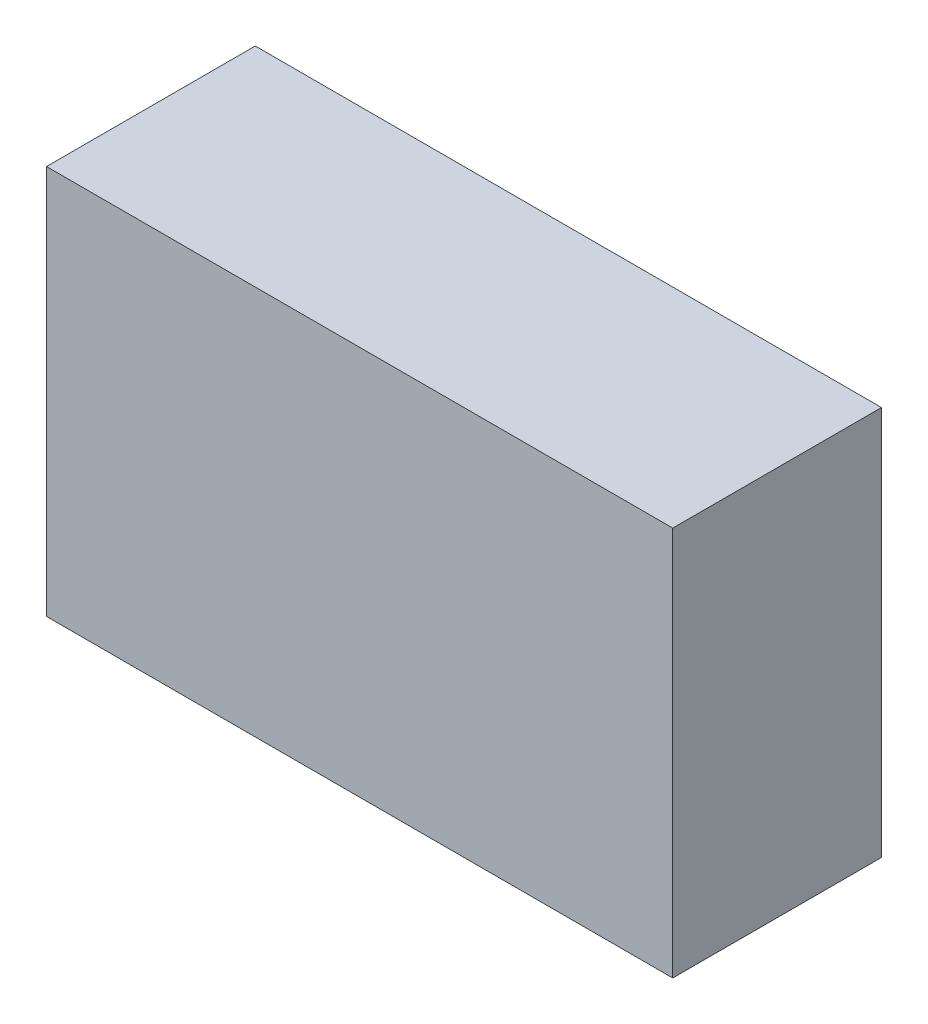
ISO-10303-21;
HEADER;
FILE_DESCRIPTION(('STEP AP214'),'2;1');
FILE_NAME('part.step','',(''),(''),'','','');
FILE_SCHEMA(('AUTOMOTIVE_DESIGN { 1 0 10303 214 1 1 1 1 }'));
ENDSEC;
DATA;
#1=APPLICATION_CONTEXT('core data for automotive mechanical design processes');
#2=APPLICATION_PROTOCOL_DEFINITION('international standard','automotive_design',2000,#1);
#3=PRODUCT_CONTEXT('',#1,'mechanical');
#4=PRODUCT('Part','Part','',(#3));
#5=PRODUCT_RELATED_PRODUCT_CATEGORY('part','',(#4));
#6=PRODUCT_DEFINITION_FORMATION('','',#4);
#7=PRODUCT_DEFINITION_CONTEXT('part definition',#1,'design');
#8=PRODUCT_DEFINITION('design','',#6,#7);
#9=PRODUCT_DEFINITION_SHAPE('','',#8);
#10=(LENGTH_UNIT() NAMED_UNIT(*) SI_UNIT(.MILLI.,.METRE.));
#11=(NAMED_UNIT(*) PLANE_ANGLE_UNIT() SI_UNIT($,.RADIAN.));
#12=(NAMED_UNIT(*) SI_UNIT($,.STERADIAN.) SOLID_ANGLE_UNIT());
#13=UNCERTAINTY_MEASURE_WITH_UNIT(LENGTH_MEASURE(1.E-05),#10,'distance_accuracy_value','');
#14=(GEOMETRIC_REPRESENTATION_CONTEXT(3) GLOBAL_UNCERTAINTY_ASSIGNED_CONTEXT((#13)) GLOBAL_UNIT_ASSIGNED_CONTEXT((#10,
#11,#12)) REPRESENTATION_CONTEXT('',''));
#15=CARTESIAN_POINT('',(0.,0.,0.));
#16=DIRECTION('',(0.,0.,1.));
#17=DIRECTION('',(1.,0.,0.));
#18=AXIS2_PLACEMENT_3D('',#15,#16,#17);
#19=CARTESIAN_POINT('',(-22.5,-14.,15.));
#20=DIRECTION('',(1.,0.,0.));
#21=DIRECTION('',(0.,0.,-1.));
#22=AXIS2_PLACEMENT_3D('',#19,#20,#21);
#23=PLANE('',#22);
#24=DIRECTION('',(0.,-1.,0.));
#25=VECTOR('',#24,1.);
#26=CARTESIAN_POINT('',(-22.5,-14.,0.));
#27=LINE('',#26,#25);
#28=CARTESIAN_POINT('',(-22.5,14.,0.));
#29=VERTEX_POINT('',#28);
#30=CARTESIAN_POINT('',(-22.5,-14.,0.));
#31=VERTEX_POINT('',#30);
#32=EDGE_CURVE('E102',#29,#31,#27,.T.);
#33=ORIENTED_EDGE('',*,*,#32,.T.);
#34=DIRECTION('',(0.,0.,-1.));
#35=VECTOR('',#34,1.);
#36=CARTESIAN_POINT('',(-22.5,-14.,15.));
#37=LINE('',#36,#35);
#38=CARTESIAN_POINT('',(-22.5,-14.,15.));
#39=VERTEX_POINT('',#38);
#40=EDGE_CURVE('E11',#39,#31,#37,.T.);
#41=ORIENTED_EDGE('',*,*,#40,.F.);
#42=DIRECTION('',(0.,-1.,0.));
#43=VECTOR('',#42,1.);
#44=CARTESIAN_POINT('',(-22.5,-14.,15.));
#45=LINE('',#44,#43);
#46=CARTESIAN_POINT('',(-22.5,14.,15.));
#47=VERTEX_POINT('',#46);
#48=EDGE_CURVE('E90',#47,#39,#45,.T.);
#49=ORIENTED_EDGE('',*,*,#48,.F.);
#50=DIRECTION('',(0.,0.,-1.));
#51=VECTOR('',#50,1.);
#52=CARTESIAN_POINT('',(-22.5,14.,15.));
#53=LINE('',#52,#51);
#54=EDGE_CURVE('E98',#47,#29,#53,.T.);
#55=ORIENTED_EDGE('',*,*,#54,.T.);
#56=EDGE_LOOP('',(#33,#41,#49,#55));
#57=FACE_BOUND('',#56,.T.);
#58=ADVANCED_FACE('F39',(#57),#23,.F.);
#59=CARTESIAN_POINT('',(-22.5,-14.,15.));
#60=DIRECTION('',(0.,1.,0.));
#61=DIRECTION('',(0.,0.,1.));
#62=AXIS2_PLACEMENT_3D('',#59,#60,#61);
#63=PLANE('',#62);
#64=DIRECTION('',(1.,0.,0.));
#65=VECTOR('',#64,1.);
#66=CARTESIAN_POINT('',(-22.5,-14.,0.));
#67=LINE('',#66,#65);
#68=CARTESIAN_POINT('',(22.5,-14.,0.));
#69=VERTEX_POINT('',#68);
#70=EDGE_CURVE('E94',#31,#69,#67,.T.);
#71=ORIENTED_EDGE('',*,*,#70,.T.);
#72=DIRECTION('',(0.,0.,-1.));
#73=VECTOR('',#72,1.);
#74=CARTESIAN_POINT('',(22.5,-14.,15.));
#75=LINE('',#74,#73);
#76=CARTESIAN_POINT('',(22.5,-14.,15.));
#77=VERTEX_POINT('',#76);
#78=EDGE_CURVE('E47',#77,#69,#75,.T.);
#79=ORIENTED_EDGE('',*,*,#78,.F.);
#80=DIRECTION('',(1.,0.,0.));
#81=VECTOR('',#80,1.);
#82=CARTESIAN_POINT('',(-22.5,-14.,15.));
#83=LINE('',#82,#81);
#84=EDGE_CURVE('E85',#39,#77,#83,.T.);
#85=ORIENTED_EDGE('',*,*,#84,.F.);
#86=ORIENTED_EDGE('',*,*,#40,.T.);
#87=EDGE_LOOP('',(#71,#79,#85,#86));
#88=FACE_BOUND('',#87,.T.);
#89=ADVANCED_FACE('F93',(#88),#63,.F.);
#90=CARTESIAN_POINT('',(22.5,-14.,15.));
#91=DIRECTION('',(-1.,0.,0.));
#92=DIRECTION('',(0.,0.,1.));
#93=AXIS2_PLACEMENT_3D('',#90,#91,#92);
#94=PLANE('',#93);
#95=DIRECTION('',(0.,1.,0.));
#96=VECTOR('',#95,1.);
#97=CARTESIAN_POINT('',(22.5,-14.,0.));
#98=LINE('',#97,#96);
#99=CARTESIAN_POINT('',(22.5,14.,0.));
#100=VERTEX_POINT('',#99);
#101=EDGE_CURVE('E72',#69,#100,#98,.T.);
#102=ORIENTED_EDGE('',*,*,#101,.T.);
#103=DIRECTION('',(0.,0.,-1.));
#104=VECTOR('',#103,1.);
#105=CARTESIAN_POINT('',(22.5,14.,15.));
#106=LINE('',#105,#104);
#107=CARTESIAN_POINT('',(22.5,14.,15.));
#108=VERTEX_POINT('',#107);
#109=EDGE_CURVE('E95',#108,#100,#106,.T.);
#110=ORIENTED_EDGE('',*,*,#109,.F.);
#111=DIRECTION('',(0.,1.,0.));
#112=VECTOR('',#111,1.);
#113=CARTESIAN_POINT('',(22.5,-14.,15.));
#114=LINE('',#113,#112);
#115=EDGE_CURVE('E88',#77,#108,#114,.T.);
#116=ORIENTED_EDGE('',*,*,#115,.F.);
#117=ORIENTED_EDGE('',*,*,#78,.T.);
#118=EDGE_LOOP('',(#102,#110,#116,#117));
#119=FACE_BOUND('',#118,.T.);
#120=ADVANCED_FACE('F96',(#119),#94,.F.);
#121=CARTESIAN_POINT('',(-22.5,14.,15.));
#122=DIRECTION('',(0.,-1.,0.));
#123=DIRECTION('',(0.,0.,-1.));
#124=AXIS2_PLACEMENT_3D('',#121,#122,#123);
#125=PLANE('',#124);
#126=DIRECTION('',(-1.,0.,0.));
#127=VECTOR('',#126,1.);
#128=CARTESIAN_POINT('',(-22.5,14.,0.));
#129=LINE('',#128,#127);
#130=EDGE_CURVE('E78',#100,#29,#129,.T.);
#131=ORIENTED_EDGE('',*,*,#130,.T.);
#132=ORIENTED_EDGE('',*,*,#54,.F.);
#133=DIRECTION('',(-1.,0.,0.));
#134=VECTOR('',#133,1.);
#135=CARTESIAN_POINT('',(-22.5,14.,15.));
#136=LINE('',#135,#134);
#137=EDGE_CURVE('E55',#108,#47,#136,.T.);
#138=ORIENTED_EDGE('',*,*,#137,.F.);
#139=ORIENTED_EDGE('',*,*,#109,.T.);
#140=EDGE_LOOP('',(#131,#132,#138,#139));
#141=FACE_BOUND('',#140,.T.);
#142=ADVANCED_FACE('F109',(#141),#125,.F.);
#143=CARTESIAN_POINT('',(0.,0.,15.));
#144=DIRECTION('',(0.,0.,-1.));
#145=DIRECTION('',(-1.,0.,0.));
#146=AXIS2_PLACEMENT_3D('',#143,#144,#145);
#147=PLANE('',#146);
#148=ORIENTED_EDGE('',*,*,#48,.T.);
#149=ORIENTED_EDGE('',*,*,#84,.T.);
#150=ORIENTED_EDGE('',*,*,#115,.T.);
#151=ORIENTED_EDGE('',*,*,#137,.T.);
#152=EDGE_LOOP('',(#148,#149,#150,#151));
#153=FACE_BOUND('',#152,.T.);
#154=ADVANCED_FACE('F86',(#153),#147,.F.);
#155=CARTESIAN_POINT('',(0.,0.,0.));
#156=DIRECTION('',(0.,0.,-1.));
#157=DIRECTION('',(-1.,0.,0.));
#158=AXIS2_PLACEMENT_3D('',#155,#156,#157);
#159=PLANE('',#158);
#160=ORIENTED_EDGE('',*,*,#32,.F.);
#161=ORIENTED_EDGE('',*,*,#130,.F.);
#162=ORIENTED_EDGE('',*,*,#101,.F.);
#163=ORIENTED_EDGE('',*,*,#70,.F.);
#164=EDGE_LOOP('',(#160,#161,#162,#163));
#165=FACE_BOUND('',#164,.T.);
#166=ADVANCED_FACE('F112',(#165),#159,.T.);
#167=CLOSED_SHELL('',(#58,#89,#120,#142,#154,#166));
#168=MANIFOLD_SOLID_BREP('B2',#167);
#169=ADVANCED_BREP_SHAPE_REPRESENTATION('',(#18,#168),#14);
#170=SHAPE_DEFINITION_REPRESENTATION(#9,#169);
ENDSEC;
END-ISO-10303-21;
